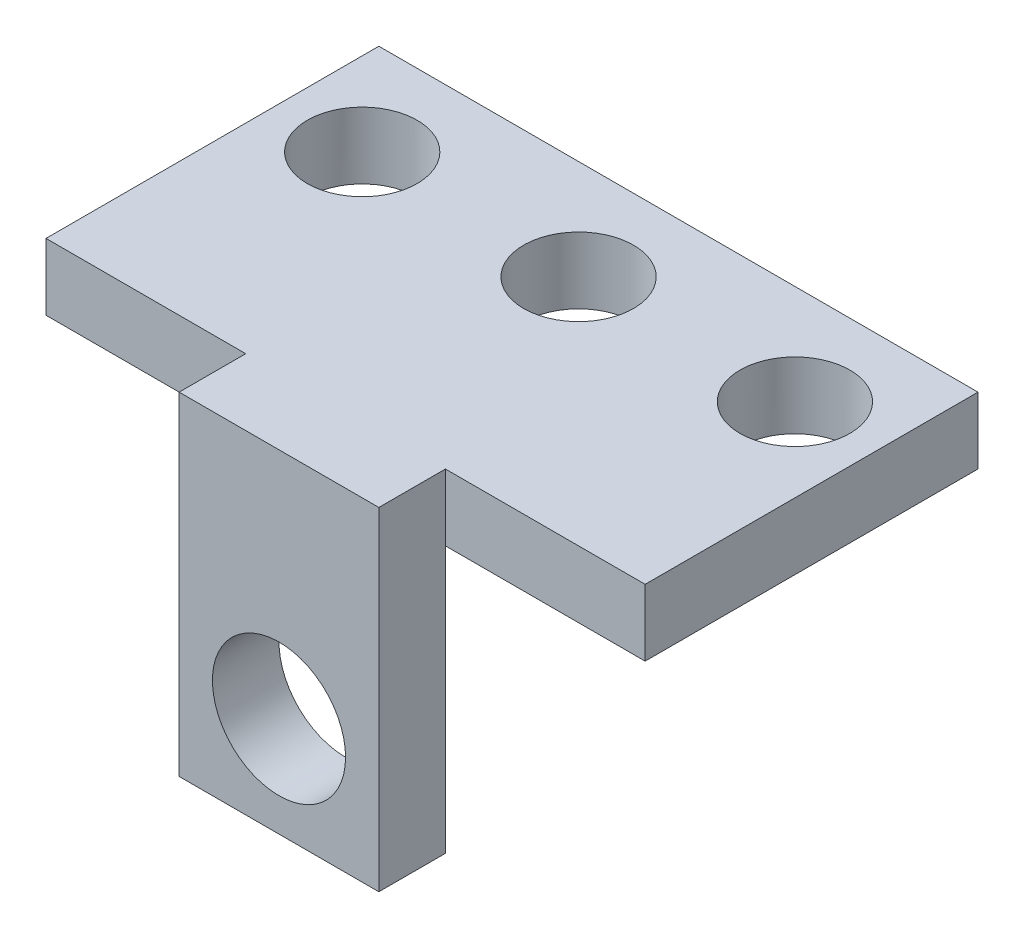
ISO-10303-21;
HEADER;
FILE_DESCRIPTION(('STEP AP214'),'2;1');
FILE_NAME('part.step','',(''),(''),'','','');
FILE_SCHEMA(('AUTOMOTIVE_DESIGN { 1 0 10303 214 1 1 1 1 }'));
ENDSEC;
DATA;
#1=APPLICATION_CONTEXT('core data for automotive mechanical design processes');
#2=APPLICATION_PROTOCOL_DEFINITION('international standard','automotive_design',2000,#1);
#3=PRODUCT_CONTEXT('',#1,'mechanical');
#4=PRODUCT('Part','Part','',(#3));
#5=PRODUCT_RELATED_PRODUCT_CATEGORY('part','',(#4));
#6=PRODUCT_DEFINITION_FORMATION('','',#4);
#7=PRODUCT_DEFINITION_CONTEXT('part definition',#1,'design');
#8=PRODUCT_DEFINITION('design','',#6,#7);
#9=PRODUCT_DEFINITION_SHAPE('','',#8);
#10=(LENGTH_UNIT() NAMED_UNIT(*) SI_UNIT(.MILLI.,.METRE.));
#11=(NAMED_UNIT(*) PLANE_ANGLE_UNIT() SI_UNIT($,.RADIAN.));
#12=(NAMED_UNIT(*) SI_UNIT($,.STERADIAN.) SOLID_ANGLE_UNIT());
#13=UNCERTAINTY_MEASURE_WITH_UNIT(LENGTH_MEASURE(1.E-05),#10,'distance_accuracy_value','');
#14=(GEOMETRIC_REPRESENTATION_CONTEXT(3) GLOBAL_UNCERTAINTY_ASSIGNED_CONTEXT((#13)) GLOBAL_UNIT_ASSIGNED_CONTEXT((#10,
#11,#12)) REPRESENTATION_CONTEXT('',''));
#15=CARTESIAN_POINT('',(0.,0.,0.));
#16=DIRECTION('',(0.,0.,1.));
#17=DIRECTION('',(1.,0.,0.));
#18=AXIS2_PLACEMENT_3D('',#15,#16,#17);
#19=CARTESIAN_POINT('',(3.,-3.,2.));
#20=DIRECTION('',(-1.,0.,0.));
#21=DIRECTION('',(0.,0.,1.));
#22=AXIS2_PLACEMENT_3D('',#19,#20,#21);
#23=PLANE('',#22);
#24=DIRECTION('',(0.,-1.,0.));
#25=VECTOR('',#24,1.);
#26=CARTESIAN_POINT('',(3.,5.,0.));
#27=LINE('',#26,#25);
#28=CARTESIAN_POINT('',(3.,7.,0.));
#29=VERTEX_POINT('',#28);
#30=CARTESIAN_POINT('',(3.,5.,0.));
#31=VERTEX_POINT('',#30);
#32=EDGE_CURVE('E58',#29,#31,#27,.T.);
#33=ORIENTED_EDGE('',*,*,#32,.F.);
#34=DIRECTION('',(0.,0.,-1.));
#35=VECTOR('',#34,1.);
#36=CARTESIAN_POINT('',(3.,7.,2.));
#37=LINE('',#36,#35);
#38=CARTESIAN_POINT('',(3.,7.,2.));
#39=VERTEX_POINT('',#38);
#40=EDGE_CURVE('E201',#39,#29,#37,.T.);
#41=ORIENTED_EDGE('',*,*,#40,.F.);
#42=DIRECTION('',(0.,1.,0.));
#43=VECTOR('',#42,1.);
#44=CARTESIAN_POINT('',(3.,-3.,2.));
#45=LINE('',#44,#43);
#46=CARTESIAN_POINT('',(3.,-3.,2.));
#47=VERTEX_POINT('',#46);
#48=EDGE_CURVE('E88',#47,#39,#45,.T.);
#49=ORIENTED_EDGE('',*,*,#48,.F.);
#50=DIRECTION('',(0.,0.,-1.));
#51=VECTOR('',#50,1.);
#52=CARTESIAN_POINT('',(3.,-3.,2.));
#53=LINE('',#52,#51);
#54=CARTESIAN_POINT('',(3.,-3.,0.));
#55=VERTEX_POINT('',#54);
#56=EDGE_CURVE('E50',#47,#55,#53,.T.);
#57=ORIENTED_EDGE('',*,*,#56,.T.);
#58=DIRECTION('',(0.,1.,0.));
#59=VECTOR('',#58,1.);
#60=CARTESIAN_POINT('',(3.,-3.,0.));
#61=LINE('',#60,#59);
#62=EDGE_CURVE('E92',#55,#31,#61,.T.);
#63=ORIENTED_EDGE('',*,*,#62,.T.);
#64=EDGE_LOOP('',(#33,#41,#49,#57,#63));
#65=FACE_BOUND('',#64,.T.);
#66=ADVANCED_FACE('F41',(#65),#23,.F.);
#67=CARTESIAN_POINT('',(-3.,-3.,2.));
#68=DIRECTION('',(1.,0.,0.));
#69=DIRECTION('',(0.,0.,-1.));
#70=AXIS2_PLACEMENT_3D('',#67,#68,#69);
#71=PLANE('',#70);
#72=DIRECTION('',(0.,1.,0.));
#73=VECTOR('',#72,1.);
#74=CARTESIAN_POINT('',(-3.,7.,0.));
#75=LINE('',#74,#73);
#76=CARTESIAN_POINT('',(-3.,5.,0.));
#77=VERTEX_POINT('',#76);
#78=CARTESIAN_POINT('',(-3.,7.,0.));
#79=VERTEX_POINT('',#78);
#80=EDGE_CURVE('E160',#77,#79,#75,.T.);
#81=ORIENTED_EDGE('',*,*,#80,.F.);
#82=DIRECTION('',(0.,-1.,0.));
#83=VECTOR('',#82,1.);
#84=CARTESIAN_POINT('',(-3.,-3.,0.));
#85=LINE('',#84,#83);
#86=CARTESIAN_POINT('',(-3.,-3.,0.));
#87=VERTEX_POINT('',#86);
#88=EDGE_CURVE('E89',#77,#87,#85,.T.);
#89=ORIENTED_EDGE('',*,*,#88,.T.);
#90=DIRECTION('',(0.,0.,-1.));
#91=VECTOR('',#90,1.);
#92=CARTESIAN_POINT('',(-3.,-3.,2.));
#93=LINE('',#92,#91);
#94=CARTESIAN_POINT('',(-3.,-3.,2.));
#95=VERTEX_POINT('',#94);
#96=EDGE_CURVE('E11',#95,#87,#93,.T.);
#97=ORIENTED_EDGE('',*,*,#96,.F.);
#98=DIRECTION('',(0.,-1.,0.));
#99=VECTOR('',#98,1.);
#100=CARTESIAN_POINT('',(-3.,-3.,2.));
#101=LINE('',#100,#99);
#102=CARTESIAN_POINT('',(-3.,7.,2.));
#103=VERTEX_POINT('',#102);
#104=EDGE_CURVE('E219',#103,#95,#101,.T.);
#105=ORIENTED_EDGE('',*,*,#104,.F.);
#106=DIRECTION('',(0.,0.,1.));
#107=VECTOR('',#106,1.);
#108=CARTESIAN_POINT('',(-3.,7.,2.));
#109=LINE('',#108,#107);
#110=EDGE_CURVE('E208',#79,#103,#109,.T.);
#111=ORIENTED_EDGE('',*,*,#110,.F.);
#112=EDGE_LOOP('',(#81,#89,#97,#105,#111));
#113=FACE_BOUND('',#112,.T.);
#114=ADVANCED_FACE('F234',(#113),#71,.F.);
#115=CARTESIAN_POINT('',(0.,0.,2.));
#116=DIRECTION('',(0.,0.,-1.));
#117=DIRECTION('',(-1.,0.,0.));
#118=AXIS2_PLACEMENT_3D('',#115,#116,#117);
#119=PLANE('',#118);
#120=ORIENTED_EDGE('',*,*,#48,.T.);
#121=DIRECTION('',(1.,0.,0.));
#122=VECTOR('',#121,1.);
#123=CARTESIAN_POINT('',(3.,7.,2.));
#124=LINE('',#123,#122);
#125=EDGE_CURVE('E197',#103,#39,#124,.T.);
#126=ORIENTED_EDGE('',*,*,#125,.F.);
#127=ORIENTED_EDGE('',*,*,#104,.T.);
#128=DIRECTION('',(1.,0.,0.));
#129=VECTOR('',#128,1.);
#130=CARTESIAN_POINT('',(-3.,-3.,2.));
#131=LINE('',#130,#129);
#132=EDGE_CURVE('E67',#95,#47,#131,.T.);
#133=ORIENTED_EDGE('',*,*,#132,.T.);
#134=EDGE_LOOP('',(#120,#126,#127,#133));
#135=FACE_BOUND('',#134,.T.);
#136=CARTESIAN_POINT('',(0.,0.,2.));
#137=DIRECTION('',(0.,0.,1.));
#138=DIRECTION('',(1.,0.,0.));
#139=AXIS2_PLACEMENT_3D('',#136,#137,#138);
#140=CIRCLE('',#139,2.);
#141=CARTESIAN_POINT('',(2.,0.,2.));
#142=VERTEX_POINT('',#141);
#143=EDGE_CURVE('E101',#142,#142,#140,.T.);
#144=ORIENTED_EDGE('',*,*,#143,.F.);
#145=EDGE_LOOP('',(#144));
#146=FACE_BOUND('',#145,.T.);
#147=ADVANCED_FACE('F228',(#135,#146),#119,.F.);
#148=CARTESIAN_POINT('',(0.,0.,0.));
#149=DIRECTION('',(0.,0.,-1.));
#150=DIRECTION('',(-1.,0.,0.));
#151=AXIS2_PLACEMENT_3D('',#148,#149,#150);
#152=PLANE('',#151);
#153=ORIENTED_EDGE('',*,*,#62,.F.);
#154=DIRECTION('',(1.,0.,0.));
#155=VECTOR('',#154,1.);
#156=CARTESIAN_POINT('',(-3.,-3.,0.));
#157=LINE('',#156,#155);
#158=EDGE_CURVE('E79',#87,#55,#157,.T.);
#159=ORIENTED_EDGE('',*,*,#158,.F.);
#160=ORIENTED_EDGE('',*,*,#88,.F.);
#161=DIRECTION('',(-1.,0.,0.));
#162=VECTOR('',#161,1.);
#163=CARTESIAN_POINT('',(-3.,5.,0.));
#164=LINE('',#163,#162);
#165=EDGE_CURVE('E99',#31,#77,#164,.T.);
#166=ORIENTED_EDGE('',*,*,#165,.F.);
#167=EDGE_LOOP('',(#153,#159,#160,#166));
#168=FACE_BOUND('',#167,.T.);
#169=CARTESIAN_POINT('',(0.,0.,0.));
#170=DIRECTION('',(0.,0.,1.));
#171=DIRECTION('',(1.,0.,0.));
#172=AXIS2_PLACEMENT_3D('',#169,#170,#171);
#173=CIRCLE('',#172,2.);
#174=CARTESIAN_POINT('',(2.,0.,0.));
#175=VERTEX_POINT('',#174);
#176=EDGE_CURVE('E108',#175,#175,#173,.T.);
#177=ORIENTED_EDGE('',*,*,#176,.T.);
#178=EDGE_LOOP('',(#177));
#179=FACE_BOUND('',#178,.T.);
#180=ADVANCED_FACE('F96',(#168,#179),#152,.T.);
#181=CARTESIAN_POINT('',(-3.,-3.,2.));
#182=DIRECTION('',(0.,1.,0.));
#183=DIRECTION('',(0.,0.,1.));
#184=AXIS2_PLACEMENT_3D('',#181,#182,#183);
#185=PLANE('',#184);
#186=ORIENTED_EDGE('',*,*,#158,.T.);
#187=ORIENTED_EDGE('',*,*,#56,.F.);
#188=ORIENTED_EDGE('',*,*,#132,.F.);
#189=ORIENTED_EDGE('',*,*,#96,.T.);
#190=EDGE_LOOP('',(#186,#187,#188,#189));
#191=FACE_BOUND('',#190,.T.);
#192=ADVANCED_FACE('F81',(#191),#185,.F.);
#193=CARTESIAN_POINT('',(0.,0.,2.));
#194=DIRECTION('',(0.,0.,-1.));
#195=DIRECTION('',(-1.,0.,0.));
#196=AXIS2_PLACEMENT_3D('',#193,#194,#195);
#197=CYLINDRICAL_SURFACE('',#196,2.);
#198=ORIENTED_EDGE('',*,*,#143,.T.);
#199=EDGE_LOOP('',(#198));
#200=FACE_BOUND('',#199,.T.);
#201=ORIENTED_EDGE('',*,*,#176,.F.);
#202=EDGE_LOOP('',(#201));
#203=FACE_BOUND('',#202,.T.);
#204=ADVANCED_FACE('F307',(#200,#203),#197,.F.);
#205=CARTESIAN_POINT('',(0.,7.,0.));
#206=DIRECTION('',(0.,-1.,0.));
#207=DIRECTION('',(0.,0.,-1.));
#208=AXIS2_PLACEMENT_3D('',#205,#206,#207);
#209=PLANE('',#208);
#210=CARTESIAN_POINT('',(-6.5,7.,-7.));
#211=DIRECTION('',(0.,1.,0.));
#212=DIRECTION('',(0.,0.,1.));
#213=AXIS2_PLACEMENT_3D('',#210,#211,#212);
#214=CIRCLE('',#213,1.65);
#215=CARTESIAN_POINT('',(-6.5,7.,-5.35));
#216=VERTEX_POINT('',#215);
#217=EDGE_CURVE('E117',#216,#216,#214,.T.);
#218=ORIENTED_EDGE('',*,*,#217,.F.);
#219=EDGE_LOOP('',(#218));
#220=FACE_BOUND('',#219,.T.);
#221=CARTESIAN_POINT('',(6.5,7.,-7.));
#222=DIRECTION('',(0.,1.,0.));
#223=DIRECTION('',(0.,0.,1.));
#224=AXIS2_PLACEMENT_3D('',#221,#222,#223);
#225=CIRCLE('',#224,1.65);
#226=CARTESIAN_POINT('',(6.5,7.,-5.35));
#227=VERTEX_POINT('',#226);
#228=EDGE_CURVE('E125',#227,#227,#225,.T.);
#229=ORIENTED_EDGE('',*,*,#228,.F.);
#230=EDGE_LOOP('',(#229));
#231=FACE_BOUND('',#230,.T.);
#232=ORIENTED_EDGE('',*,*,#125,.T.);
#233=ORIENTED_EDGE('',*,*,#40,.T.);
#234=DIRECTION('',(-1.,0.,0.));
#235=VECTOR('',#234,1.);
#236=CARTESIAN_POINT('',(9.,7.,0.));
#237=LINE('',#236,#235);
#238=CARTESIAN_POINT('',(9.,7.,0.));
#239=VERTEX_POINT('',#238);
#240=EDGE_CURVE('E156',#239,#29,#237,.T.);
#241=ORIENTED_EDGE('',*,*,#240,.F.);
#242=DIRECTION('',(0.,0.,1.));
#243=VECTOR('',#242,1.);
#244=CARTESIAN_POINT('',(9.,7.,-10.));
#245=LINE('',#244,#243);
#246=CARTESIAN_POINT('',(9.,7.,-10.));
#247=VERTEX_POINT('',#246);
#248=EDGE_CURVE('E138',#247,#239,#245,.T.);
#249=ORIENTED_EDGE('',*,*,#248,.F.);
#250=DIRECTION('',(-1.,0.,0.));
#251=VECTOR('',#250,1.);
#252=CARTESIAN_POINT('',(-3.,7.,-10.));
#253=LINE('',#252,#251);
#254=CARTESIAN_POINT('',(-9.,7.,-10.));
#255=VERTEX_POINT('',#254);
#256=EDGE_CURVE('E204',#247,#255,#253,.T.);
#257=ORIENTED_EDGE('',*,*,#256,.T.);
#258=DIRECTION('',(0.,0.,-1.));
#259=VECTOR('',#258,1.);
#260=CARTESIAN_POINT('',(-9.,7.,-10.));
#261=LINE('',#260,#259);
#262=CARTESIAN_POINT('',(-9.,7.,0.));
#263=VERTEX_POINT('',#262);
#264=EDGE_CURVE('E173',#263,#255,#261,.T.);
#265=ORIENTED_EDGE('',*,*,#264,.F.);
#266=DIRECTION('',(1.,0.,0.));
#267=VECTOR('',#266,1.);
#268=CARTESIAN_POINT('',(-9.,7.,0.));
#269=LINE('',#268,#267);
#270=EDGE_CURVE('E177',#263,#79,#269,.T.);
#271=ORIENTED_EDGE('',*,*,#270,.T.);
#272=ORIENTED_EDGE('',*,*,#110,.T.);
#273=EDGE_LOOP('',(#232,#233,#241,#249,#257,#265,#271,#272));
#274=FACE_BOUND('',#273,.T.);
#275=CARTESIAN_POINT('',(0.,7.,-7.));
#276=DIRECTION('',(0.,1.,0.));
#277=DIRECTION('',(0.,0.,1.));
#278=AXIS2_PLACEMENT_3D('',#275,#276,#277);
#279=CIRCLE('',#278,1.65);
#280=CARTESIAN_POINT('',(0.,7.,-5.35));
#281=VERTEX_POINT('',#280);
#282=EDGE_CURVE('E189',#281,#281,#279,.T.);
#283=ORIENTED_EDGE('',*,*,#282,.F.);
#284=EDGE_LOOP('',(#283));
#285=FACE_BOUND('',#284,.T.);
#286=ADVANCED_FACE('F266',(#220,#231,#274,#285),#209,.F.);
#287=CARTESIAN_POINT('',(0.,5.,0.));
#288=DIRECTION('',(0.,-1.,0.));
#289=DIRECTION('',(0.,0.,-1.));
#290=AXIS2_PLACEMENT_3D('',#287,#288,#289);
#291=PLANE('',#290);
#292=CARTESIAN_POINT('',(-6.5,5.,-7.));
#293=DIRECTION('',(0.,-1.,0.));
#294=DIRECTION('',(0.,0.,-1.));
#295=AXIS2_PLACEMENT_3D('',#292,#293,#294);
#296=CIRCLE('',#295,1.65);
#297=CARTESIAN_POINT('',(-6.5,5.,-8.65));
#298=VERTEX_POINT('',#297);
#299=EDGE_CURVE('E44',#298,#298,#296,.T.);
#300=ORIENTED_EDGE('',*,*,#299,.F.);
#301=EDGE_LOOP('',(#300));
#302=FACE_BOUND('',#301,.T.);
#303=CARTESIAN_POINT('',(6.5,5.,-7.));
#304=DIRECTION('',(0.,-1.,0.));
#305=DIRECTION('',(0.,0.,-1.));
#306=AXIS2_PLACEMENT_3D('',#303,#304,#305);
#307=CIRCLE('',#306,1.65);
#308=CARTESIAN_POINT('',(6.5,5.,-8.65));
#309=VERTEX_POINT('',#308);
#310=EDGE_CURVE('E114',#309,#309,#307,.T.);
#311=ORIENTED_EDGE('',*,*,#310,.F.);
#312=EDGE_LOOP('',(#311));
#313=FACE_BOUND('',#312,.T.);
#314=DIRECTION('',(-1.,0.,0.));
#315=VECTOR('',#314,1.);
#316=CARTESIAN_POINT('',(-3.,5.,-10.));
#317=LINE('',#316,#315);
#318=CARTESIAN_POINT('',(9.,5.,-10.));
#319=VERTEX_POINT('',#318);
#320=CARTESIAN_POINT('',(-9.,5.,-10.));
#321=VERTEX_POINT('',#320);
#322=EDGE_CURVE('E193',#319,#321,#317,.T.);
#323=ORIENTED_EDGE('',*,*,#322,.F.);
#324=DIRECTION('',(0.,0.,-1.));
#325=VECTOR('',#324,1.);
#326=CARTESIAN_POINT('',(9.,5.,-10.));
#327=LINE('',#326,#325);
#328=CARTESIAN_POINT('',(9.,5.,0.));
#329=VERTEX_POINT('',#328);
#330=EDGE_CURVE('E146',#329,#319,#327,.T.);
#331=ORIENTED_EDGE('',*,*,#330,.F.);
#332=DIRECTION('',(-1.,0.,0.));
#333=VECTOR('',#332,1.);
#334=CARTESIAN_POINT('',(9.,5.,0.));
#335=LINE('',#334,#333);
#336=EDGE_CURVE('E150',#329,#31,#335,.T.);
#337=ORIENTED_EDGE('',*,*,#336,.T.);
#338=ORIENTED_EDGE('',*,*,#165,.T.);
#339=DIRECTION('',(1.,0.,0.));
#340=VECTOR('',#339,1.);
#341=CARTESIAN_POINT('',(-9.,5.,0.));
#342=LINE('',#341,#340);
#343=CARTESIAN_POINT('',(-9.,5.,0.));
#344=VERTEX_POINT('',#343);
#345=EDGE_CURVE('E184',#344,#77,#342,.T.);
#346=ORIENTED_EDGE('',*,*,#345,.F.);
#347=DIRECTION('',(0.,0.,1.));
#348=VECTOR('',#347,1.);
#349=CARTESIAN_POINT('',(-9.,5.,-10.));
#350=LINE('',#349,#348);
#351=EDGE_CURVE('E165',#321,#344,#350,.T.);
#352=ORIENTED_EDGE('',*,*,#351,.F.);
#353=EDGE_LOOP('',(#323,#331,#337,#338,#346,#352));
#354=FACE_BOUND('',#353,.T.);
#355=CARTESIAN_POINT('',(0.,5.,-7.));
#356=DIRECTION('',(0.,1.,0.));
#357=DIRECTION('',(0.,0.,1.));
#358=AXIS2_PLACEMENT_3D('',#355,#356,#357);
#359=CIRCLE('',#358,1.65);
#360=CARTESIAN_POINT('',(0.,5.,-5.35));
#361=VERTEX_POINT('',#360);
#362=EDGE_CURVE('E188',#361,#361,#359,.T.);
#363=ORIENTED_EDGE('',*,*,#362,.T.);
#364=EDGE_LOOP('',(#363));
#365=FACE_BOUND('',#364,.T.);
#366=ADVANCED_FACE('F238',(#302,#313,#354,#365),#291,.T.);
#367=CARTESIAN_POINT('',(-3.,7.,-10.));
#368=DIRECTION('',(0.,0.,1.));
#369=DIRECTION('',(1.,0.,0.));
#370=AXIS2_PLACEMENT_3D('',#367,#368,#369);
#371=PLANE('',#370);
#372=ORIENTED_EDGE('',*,*,#322,.T.);
#373=DIRECTION('',(0.,-1.,0.));
#374=VECTOR('',#373,1.);
#375=CARTESIAN_POINT('',(-9.,7.,-10.));
#376=LINE('',#375,#374);
#377=EDGE_CURVE('E161',#255,#321,#376,.T.);
#378=ORIENTED_EDGE('',*,*,#377,.F.);
#379=ORIENTED_EDGE('',*,*,#256,.F.);
#380=DIRECTION('',(0.,1.,0.));
#381=VECTOR('',#380,1.);
#382=CARTESIAN_POINT('',(9.,5.,-10.));
#383=LINE('',#382,#381);
#384=EDGE_CURVE('E134',#319,#247,#383,.T.);
#385=ORIENTED_EDGE('',*,*,#384,.F.);
#386=EDGE_LOOP('',(#372,#378,#379,#385));
#387=FACE_BOUND('',#386,.T.);
#388=ADVANCED_FACE('F274',(#387),#371,.F.);
#389=CARTESIAN_POINT('',(0.,7.,-7.));
#390=DIRECTION('',(0.,-1.,0.));
#391=DIRECTION('',(0.,0.,-1.));
#392=AXIS2_PLACEMENT_3D('',#389,#390,#391);
#393=CYLINDRICAL_SURFACE('',#392,1.65);
#394=ORIENTED_EDGE('',*,*,#282,.T.);
#395=EDGE_LOOP('',(#394));
#396=FACE_BOUND('',#395,.T.);
#397=ORIENTED_EDGE('',*,*,#362,.F.);
#398=EDGE_LOOP('',(#397));
#399=FACE_BOUND('',#398,.T.);
#400=ADVANCED_FACE('F315',(#396,#399),#393,.F.);
#401=CARTESIAN_POINT('',(-9.,7.,0.));
#402=DIRECTION('',(0.,0.,-1.));
#403=DIRECTION('',(-1.,0.,0.));
#404=AXIS2_PLACEMENT_3D('',#401,#402,#403);
#405=PLANE('',#404);
#406=ORIENTED_EDGE('',*,*,#80,.T.);
#407=ORIENTED_EDGE('',*,*,#270,.F.);
#408=DIRECTION('',(0.,1.,0.));
#409=VECTOR('',#408,1.);
#410=CARTESIAN_POINT('',(-9.,7.,0.));
#411=LINE('',#410,#409);
#412=EDGE_CURVE('E169',#344,#263,#411,.T.);
#413=ORIENTED_EDGE('',*,*,#412,.F.);
#414=ORIENTED_EDGE('',*,*,#345,.T.);
#415=EDGE_LOOP('',(#406,#407,#413,#414));
#416=FACE_BOUND('',#415,.T.);
#417=ADVANCED_FACE('F246',(#416),#405,.F.);
#418=CARTESIAN_POINT('',(-9.,0.,0.));
#419=DIRECTION('',(-1.,0.,0.));
#420=DIRECTION('',(0.,0.,1.));
#421=AXIS2_PLACEMENT_3D('',#418,#419,#420);
#422=PLANE('',#421);
#423=ORIENTED_EDGE('',*,*,#377,.T.);
#424=ORIENTED_EDGE('',*,*,#351,.T.);
#425=ORIENTED_EDGE('',*,*,#412,.T.);
#426=ORIENTED_EDGE('',*,*,#264,.T.);
#427=EDGE_LOOP('',(#423,#424,#425,#426));
#428=FACE_BOUND('',#427,.T.);
#429=ADVANCED_FACE('F254',(#428),#422,.T.);
#430=CARTESIAN_POINT('',(9.,5.,0.));
#431=DIRECTION('',(0.,0.,-1.));
#432=DIRECTION('',(-1.,0.,0.));
#433=AXIS2_PLACEMENT_3D('',#430,#431,#432);
#434=PLANE('',#433);
#435=ORIENTED_EDGE('',*,*,#32,.T.);
#436=ORIENTED_EDGE('',*,*,#336,.F.);
#437=DIRECTION('',(0.,-1.,0.));
#438=VECTOR('',#437,1.);
#439=CARTESIAN_POINT('',(9.,5.,0.));
#440=LINE('',#439,#438);
#441=EDGE_CURVE('E142',#239,#329,#440,.T.);
#442=ORIENTED_EDGE('',*,*,#441,.F.);
#443=ORIENTED_EDGE('',*,*,#240,.T.);
#444=EDGE_LOOP('',(#435,#436,#442,#443));
#445=FACE_BOUND('',#444,.T.);
#446=ADVANCED_FACE('F286',(#445),#434,.F.);
#447=CARTESIAN_POINT('',(9.,0.,0.));
#448=DIRECTION('',(1.,0.,0.));
#449=DIRECTION('',(0.,0.,-1.));
#450=AXIS2_PLACEMENT_3D('',#447,#448,#449);
#451=PLANE('',#450);
#452=ORIENTED_EDGE('',*,*,#384,.T.);
#453=ORIENTED_EDGE('',*,*,#248,.T.);
#454=ORIENTED_EDGE('',*,*,#441,.T.);
#455=ORIENTED_EDGE('',*,*,#330,.T.);
#456=EDGE_LOOP('',(#452,#453,#454,#455));
#457=FACE_BOUND('',#456,.T.);
#458=ADVANCED_FACE('F283',(#457),#451,.T.);
#459=CARTESIAN_POINT('',(6.5,1.,-7.));
#460=DIRECTION('',(0.,1.,0.));
#461=DIRECTION('',(0.,0.,1.));
#462=AXIS2_PLACEMENT_3D('',#459,#460,#461);
#463=CYLINDRICAL_SURFACE('',#462,1.65);
#464=ORIENTED_EDGE('',*,*,#310,.T.);
#465=EDGE_LOOP('',(#464));
#466=FACE_BOUND('',#465,.T.);
#467=ORIENTED_EDGE('',*,*,#228,.T.);
#468=EDGE_LOOP('',(#467));
#469=FACE_BOUND('',#468,.T.);
#470=ADVANCED_FACE('F293',(#466,#469),#463,.F.);
#471=CARTESIAN_POINT('',(-6.5,1.,-7.));
#472=DIRECTION('',(0.,1.,0.));
#473=DIRECTION('',(0.,0.,1.));
#474=AXIS2_PLACEMENT_3D('',#471,#472,#473);
#475=CYLINDRICAL_SURFACE('',#474,1.65);
#476=ORIENTED_EDGE('',*,*,#299,.T.);
#477=EDGE_LOOP('',(#476));
#478=FACE_BOUND('',#477,.T.);
#479=ORIENTED_EDGE('',*,*,#217,.T.);
#480=EDGE_LOOP('',(#479));
#481=FACE_BOUND('',#480,.T.);
#482=ADVANCED_FACE('F356',(#478,#481),#475,.F.);
#483=CLOSED_SHELL('',(#66,#114,#147,#180,#192,#204,#286,#366,#388,#400,#417,#429,#446,#458,#470,#482));
#484=MANIFOLD_SOLID_BREP('B2',#483);
#485=ADVANCED_BREP_SHAPE_REPRESENTATION('',(#18,#484),#14);
#486=SHAPE_DEFINITION_REPRESENTATION(#9,#485);
ENDSEC;
END-ISO-10303-21;
